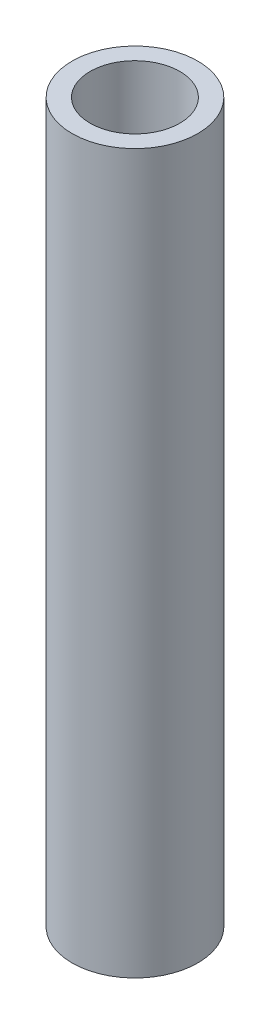
ISO-10303-21;
HEADER;
FILE_DESCRIPTION(('STEP AP214'),'2;1');
FILE_NAME('part.step','',(''),(''),'','','');
FILE_SCHEMA(('AUTOMOTIVE_DESIGN { 1 0 10303 214 1 1 1 1 }'));
ENDSEC;
DATA;
#1=APPLICATION_CONTEXT('core data for automotive mechanical design processes');
#2=APPLICATION_PROTOCOL_DEFINITION('international standard','automotive_design',2000,#1);
#3=PRODUCT_CONTEXT('',#1,'mechanical');
#4=PRODUCT('Part','Part','',(#3));
#5=PRODUCT_RELATED_PRODUCT_CATEGORY('part','',(#4));
#6=PRODUCT_DEFINITION_FORMATION('','',#4);
#7=PRODUCT_DEFINITION_CONTEXT('part definition',#1,'design');
#8=PRODUCT_DEFINITION('design','',#6,#7);
#9=PRODUCT_DEFINITION_SHAPE('','',#8);
#10=(LENGTH_UNIT() NAMED_UNIT(*) SI_UNIT(.MILLI.,.METRE.));
#11=(NAMED_UNIT(*) PLANE_ANGLE_UNIT() SI_UNIT($,.RADIAN.));
#12=(NAMED_UNIT(*) SI_UNIT($,.STERADIAN.) SOLID_ANGLE_UNIT());
#13=UNCERTAINTY_MEASURE_WITH_UNIT(LENGTH_MEASURE(1.E-05),#10,'distance_accuracy_value','');
#14=(GEOMETRIC_REPRESENTATION_CONTEXT(3) GLOBAL_UNCERTAINTY_ASSIGNED_CONTEXT((#13)) GLOBAL_UNIT_ASSIGNED_CONTEXT((#10,
#11,#12)) REPRESENTATION_CONTEXT('',''));
#15=CARTESIAN_POINT('',(0.,0.,0.));
#16=DIRECTION('',(0.,0.,1.));
#17=DIRECTION('',(1.,0.,0.));
#18=AXIS2_PLACEMENT_3D('',#15,#16,#17);
#19=CARTESIAN_POINT('',(0.,80.,0.));
#20=DIRECTION('',(0.,-1.,0.));
#21=DIRECTION('',(0.,0.,-1.));
#22=AXIS2_PLACEMENT_3D('',#19,#20,#21);
#23=CYLINDRICAL_SURFACE('',#22,7.);
#24=CARTESIAN_POINT('',(0.,80.,0.));
#25=DIRECTION('',(0.,1.,0.));
#26=DIRECTION('',(0.,0.,1.));
#27=AXIS2_PLACEMENT_3D('',#24,#25,#26);
#28=CIRCLE('',#27,7.);
#29=CARTESIAN_POINT('',(0.,80.,7.));
#30=VERTEX_POINT('',#29);
#31=EDGE_CURVE('E10',#30,#30,#28,.T.);
#32=ORIENTED_EDGE('',*,*,#31,.F.);
#33=EDGE_LOOP('',(#32));
#34=FACE_BOUND('',#33,.T.);
#35=CARTESIAN_POINT('',(0.,0.,0.));
#36=DIRECTION('',(0.,1.,0.));
#37=DIRECTION('',(0.,0.,1.));
#38=AXIS2_PLACEMENT_3D('',#35,#36,#37);
#39=CIRCLE('',#38,7.);
#40=CARTESIAN_POINT('',(0.,0.,7.));
#41=VERTEX_POINT('',#40);
#42=EDGE_CURVE('E34',#41,#41,#39,.T.);
#43=ORIENTED_EDGE('',*,*,#42,.T.);
#44=EDGE_LOOP('',(#43));
#45=FACE_BOUND('',#44,.T.);
#46=ADVANCED_FACE('F31',(#34,#45),#23,.T.);
#47=CARTESIAN_POINT('',(0.,80.,0.));
#48=DIRECTION('',(0.,1.,0.));
#49=DIRECTION('',(0.,0.,1.));
#50=AXIS2_PLACEMENT_3D('',#47,#48,#49);
#51=PLANE('',#50);
#52=CARTESIAN_POINT('',(0.,80.,0.));
#53=DIRECTION('',(0.,1.,0.));
#54=DIRECTION('',(0.,0.,1.));
#55=AXIS2_PLACEMENT_3D('',#52,#53,#54);
#56=CIRCLE('',#55,5.);
#57=CARTESIAN_POINT('',(0.,80.,5.));
#58=VERTEX_POINT('',#57);
#59=EDGE_CURVE('E43',#58,#58,#56,.T.);
#60=ORIENTED_EDGE('',*,*,#59,.F.);
#61=EDGE_LOOP('',(#60));
#62=FACE_BOUND('',#61,.T.);
#63=ORIENTED_EDGE('',*,*,#31,.T.);
#64=EDGE_LOOP('',(#63));
#65=FACE_BOUND('',#64,.T.);
#66=ADVANCED_FACE('F58',(#62,#65),#51,.T.);
#67=CARTESIAN_POINT('',(0.,0.,0.));
#68=DIRECTION('',(0.,1.,0.));
#69=DIRECTION('',(0.,0.,1.));
#70=AXIS2_PLACEMENT_3D('',#67,#68,#69);
#71=PLANE('',#70);
#72=ORIENTED_EDGE('',*,*,#42,.F.);
#73=EDGE_LOOP('',(#72));
#74=FACE_BOUND('',#73,.T.);
#75=ADVANCED_FACE('F54',(#74),#71,.F.);
#76=CARTESIAN_POINT('',(0.,60.,0.));
#77=DIRECTION('',(0.,1.,0.));
#78=DIRECTION('',(0.,0.,1.));
#79=AXIS2_PLACEMENT_3D('',#76,#77,#78);
#80=CYLINDRICAL_SURFACE('',#79,5.);
#81=CARTESIAN_POINT('',(0.,60.,0.));
#82=DIRECTION('',(0.,1.,0.));
#83=DIRECTION('',(0.,0.,1.));
#84=AXIS2_PLACEMENT_3D('',#81,#82,#83);
#85=CIRCLE('',#84,5.);
#86=CARTESIAN_POINT('',(0.,60.,5.));
#87=VERTEX_POINT('',#86);
#88=EDGE_CURVE('E41',#87,#87,#85,.T.);
#89=ORIENTED_EDGE('',*,*,#88,.F.);
#90=EDGE_LOOP('',(#89));
#91=FACE_BOUND('',#90,.T.);
#92=ORIENTED_EDGE('',*,*,#59,.T.);
#93=EDGE_LOOP('',(#92));
#94=FACE_BOUND('',#93,.T.);
#95=ADVANCED_FACE('F51',(#91,#94),#80,.F.);
#96=CARTESIAN_POINT('',(0.,60.,0.));
#97=DIRECTION('',(0.,1.,0.));
#98=DIRECTION('',(0.,0.,1.));
#99=AXIS2_PLACEMENT_3D('',#96,#97,#98);
#100=PLANE('',#99);
#101=ORIENTED_EDGE('',*,*,#88,.T.);
#102=EDGE_LOOP('',(#101));
#103=FACE_BOUND('',#102,.T.);
#104=ADVANCED_FACE('F49',(#103),#100,.T.);
#105=CLOSED_SHELL('',(#46,#66,#75,#95,#104));
#106=MANIFOLD_SOLID_BREP('B2',#105);
#107=ADVANCED_BREP_SHAPE_REPRESENTATION('',(#18,#106),#14);
#108=SHAPE_DEFINITION_REPRESENTATION(#9,#107);
ENDSEC;
END-ISO-10303-21;
